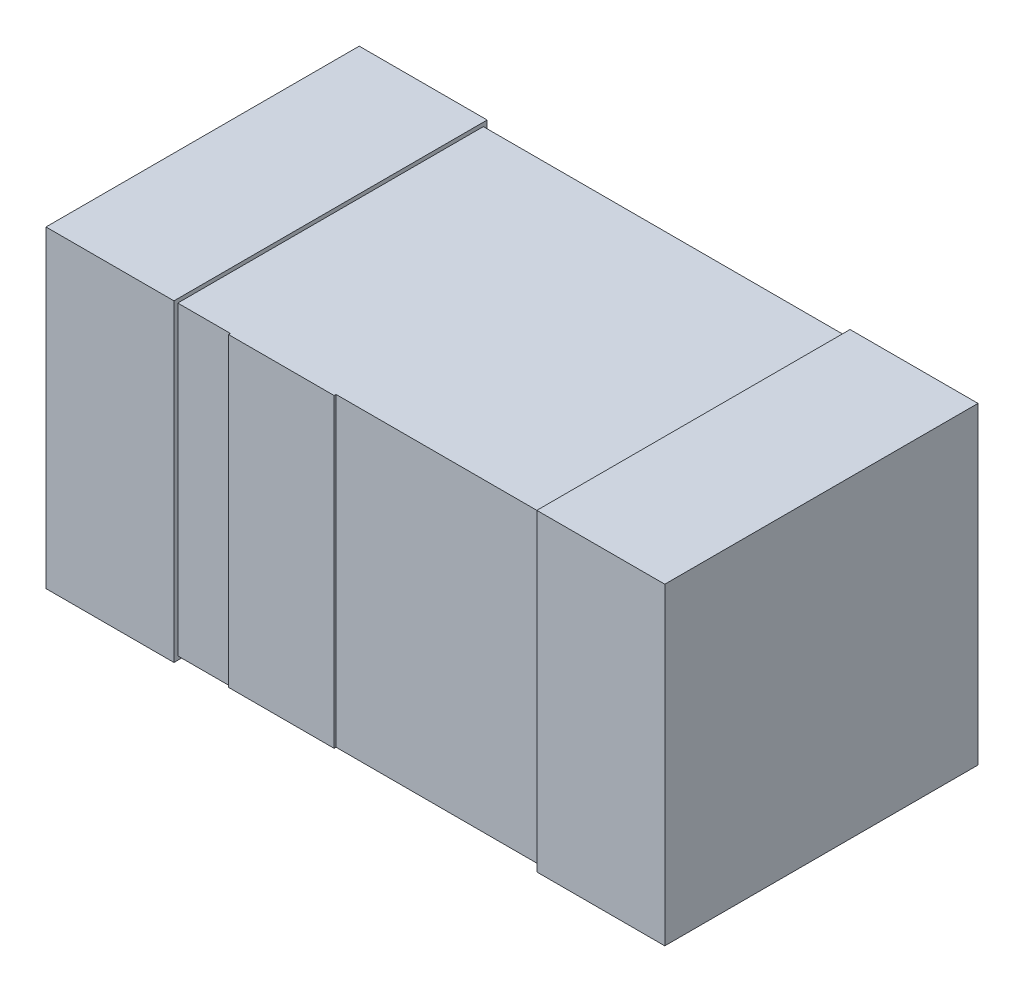
ISO-10303-21;
HEADER;
FILE_DESCRIPTION(('STEP AP214'),'2;1');
FILE_NAME('part.step','',(''),(''),'','','');
FILE_SCHEMA(('AUTOMOTIVE_DESIGN { 1 0 10303 214 1 1 1 1 }'));
ENDSEC;
DATA;
#1=APPLICATION_CONTEXT('core data for automotive mechanical design processes');
#2=APPLICATION_PROTOCOL_DEFINITION('international standard','automotive_design',2000,#1);
#3=PRODUCT_CONTEXT('',#1,'mechanical');
#4=PRODUCT('Part','Part','',(#3));
#5=PRODUCT_RELATED_PRODUCT_CATEGORY('part','',(#4));
#6=PRODUCT_DEFINITION_FORMATION('','',#4);
#7=PRODUCT_DEFINITION_CONTEXT('part definition',#1,'design');
#8=PRODUCT_DEFINITION('design','',#6,#7);
#9=PRODUCT_DEFINITION_SHAPE('','',#8);
#10=(LENGTH_UNIT() NAMED_UNIT(*) SI_UNIT(.MILLI.,.METRE.));
#11=(NAMED_UNIT(*) PLANE_ANGLE_UNIT() SI_UNIT($,.RADIAN.));
#12=(NAMED_UNIT(*) SI_UNIT($,.STERADIAN.) SOLID_ANGLE_UNIT());
#13=UNCERTAINTY_MEASURE_WITH_UNIT(LENGTH_MEASURE(1.E-05),#10,'distance_accuracy_value','');
#14=(GEOMETRIC_REPRESENTATION_CONTEXT(3) GLOBAL_UNCERTAINTY_ASSIGNED_CONTEXT((#13)) GLOBAL_UNIT_ASSIGNED_CONTEXT((#10,
#11,#12)) REPRESENTATION_CONTEXT('',''));
#15=CARTESIAN_POINT('',(0.,0.,0.));
#16=DIRECTION('',(0.,0.,1.));
#17=DIRECTION('',(1.,0.,0.));
#18=AXIS2_PLACEMENT_3D('',#15,#16,#17);
#19=CARTESIAN_POINT('',(0.,0.,1.6));
#20=DIRECTION('',(0.,0.,1.));
#21=DIRECTION('',(1.,0.,0.));
#22=AXIS2_PLACEMENT_3D('',#19,#20,#21);
#23=PLANE('',#22);
#24=DIRECTION('',(1.,0.,0.));
#25=VECTOR('',#24,1.);
#26=CARTESIAN_POINT('',(-1.6,-0.8,1.6));
#27=LINE('',#26,#25);
#28=CARTESIAN_POINT('',(-0.95,-0.8,1.6));
#29=VERTEX_POINT('',#28);
#30=CARTESIAN_POINT('',(-0.67375,-0.8,1.6));
#31=VERTEX_POINT('',#30);
#32=EDGE_CURVE('E264',#29,#31,#27,.T.);
#33=ORIENTED_EDGE('',*,*,#32,.T.);
#34=DIRECTION('',(0.,-1.,0.));
#35=VECTOR('',#34,1.);
#36=CARTESIAN_POINT('',(-0.67375,-0.8,1.6));
#37=LINE('',#36,#35);
#38=CARTESIAN_POINT('',(-0.67375,0.8,1.6));
#39=VERTEX_POINT('',#38);
#40=EDGE_CURVE('E173',#39,#31,#37,.T.);
#41=ORIENTED_EDGE('',*,*,#40,.F.);
#42=DIRECTION('',(-1.,0.,0.));
#43=VECTOR('',#42,1.);
#44=CARTESIAN_POINT('',(-1.6,0.8,1.6));
#45=LINE('',#44,#43);
#46=CARTESIAN_POINT('',(-0.95,0.8,1.6));
#47=VERTEX_POINT('',#46);
#48=EDGE_CURVE('E263',#39,#47,#45,.T.);
#49=ORIENTED_EDGE('',*,*,#48,.T.);
#50=DIRECTION('',(0.,1.,0.));
#51=VECTOR('',#50,1.);
#52=CARTESIAN_POINT('',(-0.95,0.,1.6));
#53=LINE('',#52,#51);
#54=EDGE_CURVE('E219',#29,#47,#53,.T.);
#55=ORIENTED_EDGE('',*,*,#54,.F.);
#56=EDGE_LOOP('',(#33,#41,#49,#55));
#57=FACE_BOUND('',#56,.T.);
#58=ADVANCED_FACE('F37',(#57),#23,.T.);
#59=CARTESIAN_POINT('',(0.95,0.8,1.6));
#60=VERTEX_POINT('',#59);
#61=CARTESIAN_POINT('',(-0.12125,0.8,1.6));
#62=VERTEX_POINT('',#61);
#63=EDGE_CURVE('E52',#60,#62,#45,.T.);
#64=ORIENTED_EDGE('',*,*,#63,.T.);
#65=DIRECTION('',(0.,1.,0.));
#66=VECTOR('',#65,1.);
#67=CARTESIAN_POINT('',(-0.12125,-0.8,1.6));
#68=LINE('',#67,#66);
#69=CARTESIAN_POINT('',(-0.12125,-0.8,1.6));
#70=VERTEX_POINT('',#69);
#71=EDGE_CURVE('E56',#70,#62,#68,.T.);
#72=ORIENTED_EDGE('',*,*,#71,.F.);
#73=CARTESIAN_POINT('',(0.95,-0.8,1.6));
#74=VERTEX_POINT('',#73);
#75=EDGE_CURVE('E262',#70,#74,#27,.T.);
#76=ORIENTED_EDGE('',*,*,#75,.T.);
#77=DIRECTION('',(0.,-1.,0.));
#78=VECTOR('',#77,1.);
#79=CARTESIAN_POINT('',(0.95,0.,1.6));
#80=LINE('',#79,#78);
#81=EDGE_CURVE('E257',#60,#74,#80,.T.);
#82=ORIENTED_EDGE('',*,*,#81,.F.);
#83=EDGE_LOOP('',(#64,#72,#76,#82));
#84=FACE_BOUND('',#83,.T.);
#85=ADVANCED_FACE('F299',(#84),#23,.T.);
#86=CARTESIAN_POINT('',(1.62,-0.82,-0.0200000000000001));
#87=DIRECTION('',(0.,0.,1.));
#88=DIRECTION('',(1.,0.,0.));
#89=AXIS2_PLACEMENT_3D('',#86,#87,#88);
#90=PLANE('',#89);
#91=DIRECTION('',(-1.,0.,0.));
#92=VECTOR('',#91,1.);
#93=CARTESIAN_POINT('',(1.62,-0.82,-0.0200000000000001));
#94=LINE('',#93,#92);
#95=CARTESIAN_POINT('',(1.62,-0.82,-0.0200000000000001));
#96=VERTEX_POINT('',#95);
#97=CARTESIAN_POINT('',(0.95,-0.82,-0.0200000000000001));
#98=VERTEX_POINT('',#97);
#99=EDGE_CURVE('E243',#96,#98,#94,.T.);
#100=ORIENTED_EDGE('',*,*,#99,.T.);
#101=DIRECTION('',(0.,1.,0.));
#102=VECTOR('',#101,1.);
#103=CARTESIAN_POINT('',(0.95,-0.82,-0.0200000000000001));
#104=LINE('',#103,#102);
#105=CARTESIAN_POINT('',(0.95,0.819999999999999,-0.0200000000000001));
#106=VERTEX_POINT('',#105);
#107=EDGE_CURVE('E222',#98,#106,#104,.T.);
#108=ORIENTED_EDGE('',*,*,#107,.T.);
#109=DIRECTION('',(-1.,0.,0.));
#110=VECTOR('',#109,1.);
#111=CARTESIAN_POINT('',(1.62,0.819999999999999,-0.0200000000000001));
#112=LINE('',#111,#110);
#113=CARTESIAN_POINT('',(1.62,0.819999999999999,-0.0200000000000001));
#114=VERTEX_POINT('',#113);
#115=EDGE_CURVE('E249',#114,#106,#112,.T.);
#116=ORIENTED_EDGE('',*,*,#115,.F.);
#117=DIRECTION('',(0.,1.,0.));
#118=VECTOR('',#117,1.);
#119=CARTESIAN_POINT('',(1.62,-0.82,-0.0200000000000001));
#120=LINE('',#119,#118);
#121=EDGE_CURVE('E234',#96,#114,#120,.T.);
#122=ORIENTED_EDGE('',*,*,#121,.F.);
#123=EDGE_LOOP('',(#100,#108,#116,#122));
#124=FACE_BOUND('',#123,.T.);
#125=ADVANCED_FACE('F305',(#124),#90,.F.);
#126=CARTESIAN_POINT('',(1.62,0.819999999999999,1.62));
#127=DIRECTION('',(0.,-1.,0.));
#128=DIRECTION('',(0.,0.,-1.));
#129=AXIS2_PLACEMENT_3D('',#126,#127,#128);
#130=PLANE('',#129);
#131=ORIENTED_EDGE('',*,*,#115,.T.);
#132=DIRECTION('',(0.,0.,1.));
#133=VECTOR('',#132,1.);
#134=CARTESIAN_POINT('',(0.95,0.819999999999999,1.62));
#135=LINE('',#134,#133);
#136=CARTESIAN_POINT('',(0.95,0.819999999999999,1.62));
#137=VERTEX_POINT('',#136);
#138=EDGE_CURVE('E225',#106,#137,#135,.T.);
#139=ORIENTED_EDGE('',*,*,#138,.T.);
#140=DIRECTION('',(-1.,0.,0.));
#141=VECTOR('',#140,1.);
#142=CARTESIAN_POINT('',(1.62,0.819999999999999,1.62));
#143=LINE('',#142,#141);
#144=CARTESIAN_POINT('',(1.62,0.819999999999999,1.62));
#145=VERTEX_POINT('',#144);
#146=EDGE_CURVE('E247',#145,#137,#143,.T.);
#147=ORIENTED_EDGE('',*,*,#146,.F.);
#148=DIRECTION('',(0.,0.,1.));
#149=VECTOR('',#148,1.);
#150=CARTESIAN_POINT('',(1.62,0.819999999999999,1.62));
#151=LINE('',#150,#149);
#152=EDGE_CURVE('E237',#114,#145,#151,.T.);
#153=ORIENTED_EDGE('',*,*,#152,.F.);
#154=EDGE_LOOP('',(#131,#139,#147,#153));
#155=FACE_BOUND('',#154,.T.);
#156=ADVANCED_FACE('F334',(#155),#130,.F.);
#157=CARTESIAN_POINT('',(1.62,-0.82,1.62));
#158=DIRECTION('',(0.,0.,-1.));
#159=DIRECTION('',(-1.,0.,0.));
#160=AXIS2_PLACEMENT_3D('',#157,#158,#159);
#161=PLANE('',#160);
#162=ORIENTED_EDGE('',*,*,#146,.T.);
#163=DIRECTION('',(0.,-1.,0.));
#164=VECTOR('',#163,1.);
#165=CARTESIAN_POINT('',(0.95,-0.82,1.62));
#166=LINE('',#165,#164);
#167=CARTESIAN_POINT('',(0.95,-0.82,1.62));
#168=VERTEX_POINT('',#167);
#169=EDGE_CURVE('E228',#137,#168,#166,.T.);
#170=ORIENTED_EDGE('',*,*,#169,.T.);
#171=DIRECTION('',(-1.,0.,0.));
#172=VECTOR('',#171,1.);
#173=CARTESIAN_POINT('',(1.62,-0.82,1.62));
#174=LINE('',#173,#172);
#175=CARTESIAN_POINT('',(1.62,-0.82,1.62));
#176=VERTEX_POINT('',#175);
#177=EDGE_CURVE('E245',#176,#168,#174,.T.);
#178=ORIENTED_EDGE('',*,*,#177,.F.);
#179=DIRECTION('',(0.,-1.,0.));
#180=VECTOR('',#179,1.);
#181=CARTESIAN_POINT('',(1.62,-0.82,1.62));
#182=LINE('',#181,#180);
#183=EDGE_CURVE('E239',#145,#176,#182,.T.);
#184=ORIENTED_EDGE('',*,*,#183,.F.);
#185=EDGE_LOOP('',(#162,#170,#178,#184));
#186=FACE_BOUND('',#185,.T.);
#187=ADVANCED_FACE('F331',(#186),#161,.F.);
#188=CARTESIAN_POINT('',(1.62,-0.82,1.62));
#189=DIRECTION('',(0.,1.,0.));
#190=DIRECTION('',(0.,0.,1.));
#191=AXIS2_PLACEMENT_3D('',#188,#189,#190);
#192=PLANE('',#191);
#193=ORIENTED_EDGE('',*,*,#177,.T.);
#194=DIRECTION('',(0.,0.,-1.));
#195=VECTOR('',#194,1.);
#196=CARTESIAN_POINT('',(0.95,-0.82,1.62));
#197=LINE('',#196,#195);
#198=EDGE_CURVE('E231',#168,#98,#197,.T.);
#199=ORIENTED_EDGE('',*,*,#198,.T.);
#200=ORIENTED_EDGE('',*,*,#99,.F.);
#201=DIRECTION('',(0.,0.,-1.));
#202=VECTOR('',#201,1.);
#203=CARTESIAN_POINT('',(1.62,-0.82,1.62));
#204=LINE('',#203,#202);
#205=EDGE_CURVE('E241',#176,#96,#204,.T.);
#206=ORIENTED_EDGE('',*,*,#205,.F.);
#207=EDGE_LOOP('',(#193,#199,#200,#206));
#208=FACE_BOUND('',#207,.T.);
#209=ADVANCED_FACE('F323',(#208),#192,.F.);
#210=CARTESIAN_POINT('',(1.62,0.,0.));
#211=DIRECTION('',(-1.,0.,0.));
#212=DIRECTION('',(0.,0.,1.));
#213=AXIS2_PLACEMENT_3D('',#210,#211,#212);
#214=PLANE('',#213);
#215=ORIENTED_EDGE('',*,*,#121,.T.);
#216=ORIENTED_EDGE('',*,*,#152,.T.);
#217=ORIENTED_EDGE('',*,*,#183,.T.);
#218=ORIENTED_EDGE('',*,*,#205,.T.);
#219=EDGE_LOOP('',(#215,#216,#217,#218));
#220=FACE_BOUND('',#219,.T.);
#221=ADVANCED_FACE('F318',(#220),#214,.F.);
#222=CARTESIAN_POINT('',(0.95,0.,0.));
#223=DIRECTION('',(-1.,0.,0.));
#224=DIRECTION('',(0.,0.,1.));
#225=AXIS2_PLACEMENT_3D('',#222,#223,#224);
#226=PLANE('',#225);
#227=DIRECTION('',(0.,0.,-1.));
#228=VECTOR('',#227,1.);
#229=CARTESIAN_POINT('',(0.95,0.8,1.6));
#230=LINE('',#229,#228);
#231=CARTESIAN_POINT('',(0.95,0.8,0.));
#232=VERTEX_POINT('',#231);
#233=EDGE_CURVE('E254',#60,#232,#230,.T.);
#234=ORIENTED_EDGE('',*,*,#233,.F.);
#235=ORIENTED_EDGE('',*,*,#81,.T.);
#236=DIRECTION('',(0.,0.,1.));
#237=VECTOR('',#236,1.);
#238=CARTESIAN_POINT('',(0.95,-0.8,1.6));
#239=LINE('',#238,#237);
#240=CARTESIAN_POINT('',(0.95,-0.8,0.));
#241=VERTEX_POINT('',#240);
#242=EDGE_CURVE('E251',#241,#74,#239,.T.);
#243=ORIENTED_EDGE('',*,*,#242,.F.);
#244=DIRECTION('',(0.,-1.,0.));
#245=VECTOR('',#244,1.);
#246=CARTESIAN_POINT('',(0.95,0.,0.));
#247=LINE('',#246,#245);
#248=EDGE_CURVE('E45',#232,#241,#247,.T.);
#249=ORIENTED_EDGE('',*,*,#248,.F.);
#250=EDGE_LOOP('',(#234,#235,#243,#249));
#251=FACE_BOUND('',#250,.T.);
#252=ORIENTED_EDGE('',*,*,#107,.F.);
#253=ORIENTED_EDGE('',*,*,#198,.F.);
#254=ORIENTED_EDGE('',*,*,#169,.F.);
#255=ORIENTED_EDGE('',*,*,#138,.F.);
#256=EDGE_LOOP('',(#252,#253,#254,#255));
#257=FACE_BOUND('',#256,.T.);
#258=ADVANCED_FACE('F276',(#251,#257),#226,.T.);
#259=CARTESIAN_POINT('',(-1.6,0.8,1.6));
#260=DIRECTION('',(0.,-1.,0.));
#261=DIRECTION('',(0.,0.,-1.));
#262=AXIS2_PLACEMENT_3D('',#259,#260,#261);
#263=PLANE('',#262);
#264=DIRECTION('',(-1.,0.,0.));
#265=VECTOR('',#264,1.);
#266=CARTESIAN_POINT('',(-1.6,0.8,0.));
#267=LINE('',#266,#265);
#268=CARTESIAN_POINT('',(-0.95,0.8,0.));
#269=VERTEX_POINT('',#268);
#270=EDGE_CURVE('E260',#232,#269,#267,.T.);
#271=ORIENTED_EDGE('',*,*,#270,.T.);
#272=DIRECTION('',(0.,0.,1.));
#273=VECTOR('',#272,1.);
#274=CARTESIAN_POINT('',(-0.95,0.8,1.6));
#275=LINE('',#274,#273);
#276=EDGE_CURVE('E216',#269,#47,#275,.T.);
#277=ORIENTED_EDGE('',*,*,#276,.T.);
#278=ORIENTED_EDGE('',*,*,#48,.F.);
#279=DIRECTION('',(0.,0.,-1.));
#280=VECTOR('',#279,1.);
#281=CARTESIAN_POINT('',(-0.67375,0.8,1.61));
#282=LINE('',#281,#280);
#283=CARTESIAN_POINT('',(-0.67375,0.8,1.61));
#284=VERTEX_POINT('',#283);
#285=EDGE_CURVE('E282',#284,#39,#282,.T.);
#286=ORIENTED_EDGE('',*,*,#285,.F.);
#287=DIRECTION('',(-1.,0.,0.));
#288=VECTOR('',#287,1.);
#289=CARTESIAN_POINT('',(-0.67375,0.8,1.61));
#290=LINE('',#289,#288);
#291=CARTESIAN_POINT('',(-0.12125,0.8,1.61));
#292=VERTEX_POINT('',#291);
#293=EDGE_CURVE('E166',#292,#284,#290,.T.);
#294=ORIENTED_EDGE('',*,*,#293,.F.);
#295=DIRECTION('',(0.,0.,-1.));
#296=VECTOR('',#295,1.);
#297=CARTESIAN_POINT('',(-0.12125,0.8,1.61));
#298=LINE('',#297,#296);
#299=EDGE_CURVE('E179',#292,#62,#298,.T.);
#300=ORIENTED_EDGE('',*,*,#299,.T.);
#301=ORIENTED_EDGE('',*,*,#63,.F.);
#302=ORIENTED_EDGE('',*,*,#233,.T.);
#303=EDGE_LOOP('',(#271,#277,#278,#286,#294,#300,#301,#302));
#304=FACE_BOUND('',#303,.T.);
#305=ADVANCED_FACE('F39',(#304),#263,.F.);
#306=CARTESIAN_POINT('',(-1.6,-0.8,1.6));
#307=DIRECTION('',(0.,1.,0.));
#308=DIRECTION('',(0.,0.,1.));
#309=AXIS2_PLACEMENT_3D('',#306,#307,#308);
#310=PLANE('',#309);
#311=ORIENTED_EDGE('',*,*,#32,.F.);
#312=DIRECTION('',(0.,0.,-1.));
#313=VECTOR('',#312,1.);
#314=CARTESIAN_POINT('',(-0.95,-0.8,1.6));
#315=LINE('',#314,#313);
#316=CARTESIAN_POINT('',(-0.95,-0.8,0.));
#317=VERTEX_POINT('',#316);
#318=EDGE_CURVE('E213',#29,#317,#315,.T.);
#319=ORIENTED_EDGE('',*,*,#318,.T.);
#320=DIRECTION('',(1.,0.,0.));
#321=VECTOR('',#320,1.);
#322=CARTESIAN_POINT('',(-1.6,-0.8,0.));
#323=LINE('',#322,#321);
#324=EDGE_CURVE('E268',#317,#241,#323,.T.);
#325=ORIENTED_EDGE('',*,*,#324,.T.);
#326=ORIENTED_EDGE('',*,*,#242,.T.);
#327=ORIENTED_EDGE('',*,*,#75,.F.);
#328=DIRECTION('',(0.,0.,-1.));
#329=VECTOR('',#328,1.);
#330=CARTESIAN_POINT('',(-0.12125,-0.8,1.61));
#331=LINE('',#330,#329);
#332=CARTESIAN_POINT('',(-0.12125,-0.8,1.61));
#333=VERTEX_POINT('',#332);
#334=EDGE_CURVE('E157',#333,#70,#331,.T.);
#335=ORIENTED_EDGE('',*,*,#334,.F.);
#336=DIRECTION('',(1.,0.,0.));
#337=VECTOR('',#336,1.);
#338=CARTESIAN_POINT('',(-0.67375,-0.8,1.61));
#339=LINE('',#338,#337);
#340=CARTESIAN_POINT('',(-0.67375,-0.8,1.61));
#341=VERTEX_POINT('',#340);
#342=EDGE_CURVE('E149',#341,#333,#339,.T.);
#343=ORIENTED_EDGE('',*,*,#342,.F.);
#344=DIRECTION('',(0.,0.,-1.));
#345=VECTOR('',#344,1.);
#346=CARTESIAN_POINT('',(-0.67375,-0.8,1.61));
#347=LINE('',#346,#345);
#348=EDGE_CURVE('E154',#341,#31,#347,.T.);
#349=ORIENTED_EDGE('',*,*,#348,.T.);
#350=EDGE_LOOP('',(#311,#319,#325,#326,#327,#335,#343,#349));
#351=FACE_BOUND('',#350,.T.);
#352=ADVANCED_FACE('F152',(#351),#310,.F.);
#353=CARTESIAN_POINT('',(0.,0.,0.));
#354=DIRECTION('',(0.,0.,1.));
#355=DIRECTION('',(1.,0.,0.));
#356=AXIS2_PLACEMENT_3D('',#353,#354,#355);
#357=PLANE('',#356);
#358=ORIENTED_EDGE('',*,*,#324,.F.);
#359=DIRECTION('',(0.,1.,0.));
#360=VECTOR('',#359,1.);
#361=CARTESIAN_POINT('',(-0.95,0.,0.));
#362=LINE('',#361,#360);
#363=EDGE_CURVE('E11',#317,#269,#362,.T.);
#364=ORIENTED_EDGE('',*,*,#363,.T.);
#365=ORIENTED_EDGE('',*,*,#270,.F.);
#366=ORIENTED_EDGE('',*,*,#248,.T.);
#367=EDGE_LOOP('',(#358,#364,#365,#366));
#368=FACE_BOUND('',#367,.T.);
#369=ADVANCED_FACE('F273',(#368),#357,.F.);
#370=CARTESIAN_POINT('',(-1.62,-0.82,-0.0200000000000001));
#371=DIRECTION('',(0.,0.,1.));
#372=DIRECTION('',(-1.,0.,0.));
#373=AXIS2_PLACEMENT_3D('',#370,#371,#372);
#374=PLANE('',#373);
#375=DIRECTION('',(1.,0.,0.));
#376=VECTOR('',#375,1.);
#377=CARTESIAN_POINT('',(-1.62,-0.82,-0.0200000000000001));
#378=LINE('',#377,#376);
#379=CARTESIAN_POINT('',(-1.62,-0.82,-0.0200000000000001));
#380=VERTEX_POINT('',#379);
#381=CARTESIAN_POINT('',(-0.95,-0.82,-0.0200000000000001));
#382=VERTEX_POINT('',#381);
#383=EDGE_CURVE('E193',#380,#382,#378,.T.);
#384=ORIENTED_EDGE('',*,*,#383,.F.);
#385=DIRECTION('',(0.,1.,0.));
#386=VECTOR('',#385,1.);
#387=CARTESIAN_POINT('',(-1.62,-0.82,-0.0200000000000001));
#388=LINE('',#387,#386);
#389=CARTESIAN_POINT('',(-1.62,0.819999999999999,-0.0200000000000001));
#390=VERTEX_POINT('',#389);
#391=EDGE_CURVE('E198',#380,#390,#388,.T.);
#392=ORIENTED_EDGE('',*,*,#391,.T.);
#393=DIRECTION('',(1.,0.,0.));
#394=VECTOR('',#393,1.);
#395=CARTESIAN_POINT('',(-1.62,0.819999999999999,-0.0200000000000001));
#396=LINE('',#395,#394);
#397=CARTESIAN_POINT('',(-0.95,0.819999999999999,-0.0200000000000001));
#398=VERTEX_POINT('',#397);
#399=EDGE_CURVE('E210',#390,#398,#396,.T.);
#400=ORIENTED_EDGE('',*,*,#399,.T.);
#401=DIRECTION('',(0.,1.,0.));
#402=VECTOR('',#401,1.);
#403=CARTESIAN_POINT('',(-0.95,-0.82,-0.0200000000000001));
#404=LINE('',#403,#402);
#405=EDGE_CURVE('E174',#382,#398,#404,.T.);
#406=ORIENTED_EDGE('',*,*,#405,.F.);
#407=EDGE_LOOP('',(#384,#392,#400,#406));
#408=FACE_BOUND('',#407,.T.);
#409=ADVANCED_FACE('F310',(#408),#374,.F.);
#410=CARTESIAN_POINT('',(-1.62,0.819999999999999,1.62));
#411=DIRECTION('',(0.,-1.,0.));
#412=DIRECTION('',(0.,0.,-1.));
#413=AXIS2_PLACEMENT_3D('',#410,#411,#412);
#414=PLANE('',#413);
#415=ORIENTED_EDGE('',*,*,#399,.F.);
#416=DIRECTION('',(0.,0.,1.));
#417=VECTOR('',#416,1.);
#418=CARTESIAN_POINT('',(-1.62,0.819999999999999,1.62));
#419=LINE('',#418,#417);
#420=CARTESIAN_POINT('',(-1.62,0.819999999999999,1.62));
#421=VERTEX_POINT('',#420);
#422=EDGE_CURVE('E201',#390,#421,#419,.T.);
#423=ORIENTED_EDGE('',*,*,#422,.T.);
#424=DIRECTION('',(1.,0.,0.));
#425=VECTOR('',#424,1.);
#426=CARTESIAN_POINT('',(-1.62,0.819999999999999,1.62));
#427=LINE('',#426,#425);
#428=CARTESIAN_POINT('',(-0.95,0.819999999999999,1.62));
#429=VERTEX_POINT('',#428);
#430=EDGE_CURVE('E207',#421,#429,#427,.T.);
#431=ORIENTED_EDGE('',*,*,#430,.T.);
#432=DIRECTION('',(0.,0.,1.));
#433=VECTOR('',#432,1.);
#434=CARTESIAN_POINT('',(-0.95,0.819999999999999,1.62));
#435=LINE('',#434,#433);
#436=EDGE_CURVE('E187',#398,#429,#435,.T.);
#437=ORIENTED_EDGE('',*,*,#436,.F.);
#438=EDGE_LOOP('',(#415,#423,#431,#437));
#439=FACE_BOUND('',#438,.T.);
#440=ADVANCED_FACE('F421',(#439),#414,.F.);
#441=CARTESIAN_POINT('',(-1.62,-0.82,1.62));
#442=DIRECTION('',(0.,0.,-1.));
#443=DIRECTION('',(1.,0.,0.));
#444=AXIS2_PLACEMENT_3D('',#441,#442,#443);
#445=PLANE('',#444);
#446=ORIENTED_EDGE('',*,*,#430,.F.);
#447=DIRECTION('',(0.,-1.,0.));
#448=VECTOR('',#447,1.);
#449=CARTESIAN_POINT('',(-1.62,-0.82,1.62));
#450=LINE('',#449,#448);
#451=CARTESIAN_POINT('',(-1.62,-0.82,1.62));
#452=VERTEX_POINT('',#451);
#453=EDGE_CURVE('E204',#421,#452,#450,.T.);
#454=ORIENTED_EDGE('',*,*,#453,.T.);
#455=DIRECTION('',(1.,0.,0.));
#456=VECTOR('',#455,1.);
#457=CARTESIAN_POINT('',(-1.62,-0.82,1.62));
#458=LINE('',#457,#456);
#459=CARTESIAN_POINT('',(-0.95,-0.82,1.62));
#460=VERTEX_POINT('',#459);
#461=EDGE_CURVE('E190',#452,#460,#458,.T.);
#462=ORIENTED_EDGE('',*,*,#461,.T.);
#463=DIRECTION('',(0.,-1.,0.));
#464=VECTOR('',#463,1.);
#465=CARTESIAN_POINT('',(-0.95,-0.82,1.62));
#466=LINE('',#465,#464);
#467=EDGE_CURVE('E184',#429,#460,#466,.T.);
#468=ORIENTED_EDGE('',*,*,#467,.F.);
#469=EDGE_LOOP('',(#446,#454,#462,#468));
#470=FACE_BOUND('',#469,.T.);
#471=ADVANCED_FACE('F414',(#470),#445,.F.);
#472=CARTESIAN_POINT('',(-1.62,0.,0.));
#473=DIRECTION('',(1.,0.,0.));
#474=DIRECTION('',(0.,0.,1.));
#475=AXIS2_PLACEMENT_3D('',#472,#473,#474);
#476=PLANE('',#475);
#477=ORIENTED_EDGE('',*,*,#391,.F.);
#478=DIRECTION('',(0.,0.,-1.));
#479=VECTOR('',#478,1.);
#480=CARTESIAN_POINT('',(-1.62,-0.82,1.62));
#481=LINE('',#480,#479);
#482=EDGE_CURVE('E196',#452,#380,#481,.T.);
#483=ORIENTED_EDGE('',*,*,#482,.F.);
#484=ORIENTED_EDGE('',*,*,#453,.F.);
#485=ORIENTED_EDGE('',*,*,#422,.F.);
#486=EDGE_LOOP('',(#477,#483,#484,#485));
#487=FACE_BOUND('',#486,.T.);
#488=ADVANCED_FACE('F406',(#487),#476,.F.);
#489=CARTESIAN_POINT('',(-1.62,-0.82,1.62));
#490=DIRECTION('',(0.,1.,0.));
#491=DIRECTION('',(0.,0.,1.));
#492=AXIS2_PLACEMENT_3D('',#489,#490,#491);
#493=PLANE('',#492);
#494=ORIENTED_EDGE('',*,*,#461,.F.);
#495=ORIENTED_EDGE('',*,*,#482,.T.);
#496=ORIENTED_EDGE('',*,*,#383,.T.);
#497=DIRECTION('',(0.,0.,-1.));
#498=VECTOR('',#497,1.);
#499=CARTESIAN_POINT('',(-0.95,-0.82,1.62));
#500=LINE('',#499,#498);
#501=EDGE_CURVE('E177',#460,#382,#500,.T.);
#502=ORIENTED_EDGE('',*,*,#501,.F.);
#503=EDGE_LOOP('',(#494,#495,#496,#502));
#504=FACE_BOUND('',#503,.T.);
#505=ADVANCED_FACE('F397',(#504),#493,.F.);
#506=CARTESIAN_POINT('',(-0.95,0.,0.));
#507=DIRECTION('',(1.,0.,0.));
#508=DIRECTION('',(0.,0.,1.));
#509=AXIS2_PLACEMENT_3D('',#506,#507,#508);
#510=PLANE('',#509);
#511=ORIENTED_EDGE('',*,*,#318,.F.);
#512=ORIENTED_EDGE('',*,*,#54,.T.);
#513=ORIENTED_EDGE('',*,*,#276,.F.);
#514=ORIENTED_EDGE('',*,*,#363,.F.);
#515=EDGE_LOOP('',(#511,#512,#513,#514));
#516=FACE_BOUND('',#515,.T.);
#517=ORIENTED_EDGE('',*,*,#405,.T.);
#518=ORIENTED_EDGE('',*,*,#436,.T.);
#519=ORIENTED_EDGE('',*,*,#467,.T.);
#520=ORIENTED_EDGE('',*,*,#501,.T.);
#521=EDGE_LOOP('',(#517,#518,#519,#520));
#522=FACE_BOUND('',#521,.T.);
#523=ADVANCED_FACE('F296',(#516,#522),#510,.T.);
#524=CARTESIAN_POINT('',(-0.67375,-0.8,1.61));
#525=DIRECTION('',(1.,0.,0.));
#526=DIRECTION('',(0.,0.,-1.));
#527=AXIS2_PLACEMENT_3D('',#524,#525,#526);
#528=PLANE('',#527);
#529=ORIENTED_EDGE('',*,*,#40,.T.);
#530=ORIENTED_EDGE('',*,*,#348,.F.);
#531=DIRECTION('',(0.,-1.,0.));
#532=VECTOR('',#531,1.);
#533=CARTESIAN_POINT('',(-0.67375,-0.8,1.61));
#534=LINE('',#533,#532);
#535=EDGE_CURVE('E161',#284,#341,#534,.T.);
#536=ORIENTED_EDGE('',*,*,#535,.F.);
#537=ORIENTED_EDGE('',*,*,#285,.T.);
#538=EDGE_LOOP('',(#529,#530,#536,#537));
#539=FACE_BOUND('',#538,.T.);
#540=ADVANCED_FACE('F171',(#539),#528,.F.);
#541=CARTESIAN_POINT('',(-0.12125,-0.8,1.61));
#542=DIRECTION('',(-1.,0.,0.));
#543=DIRECTION('',(0.,-1.,0.));
#544=AXIS2_PLACEMENT_3D('',#541,#542,#543);
#545=PLANE('',#544);
#546=ORIENTED_EDGE('',*,*,#71,.T.);
#547=ORIENTED_EDGE('',*,*,#299,.F.);
#548=DIRECTION('',(0.,1.,0.));
#549=VECTOR('',#548,1.);
#550=CARTESIAN_POINT('',(-0.12125,-0.8,1.61));
#551=LINE('',#550,#549);
#552=EDGE_CURVE('E160',#333,#292,#551,.T.);
#553=ORIENTED_EDGE('',*,*,#552,.F.);
#554=ORIENTED_EDGE('',*,*,#334,.T.);
#555=EDGE_LOOP('',(#546,#547,#553,#554));
#556=FACE_BOUND('',#555,.T.);
#557=ADVANCED_FACE('F288',(#556),#545,.F.);
#558=CARTESIAN_POINT('',(0.,0.,1.61));
#559=DIRECTION('',(0.,0.,-1.));
#560=DIRECTION('',(-1.,0.,0.));
#561=AXIS2_PLACEMENT_3D('',#558,#559,#560);
#562=PLANE('',#561);
#563=ORIENTED_EDGE('',*,*,#535,.T.);
#564=ORIENTED_EDGE('',*,*,#342,.T.);
#565=ORIENTED_EDGE('',*,*,#552,.T.);
#566=ORIENTED_EDGE('',*,*,#293,.T.);
#567=EDGE_LOOP('',(#563,#564,#565,#566));
#568=FACE_BOUND('',#567,.T.);
#569=ADVANCED_FACE('F164',(#568),#562,.F.);
#570=CLOSED_SHELL('',(#58,#85,#125,#156,#187,#209,#221,#258,#305,#352,#369,#409,#440,#471,#488,
#505,#523,#540,#557,#569));
#571=MANIFOLD_SOLID_BREP('B2',#570);
#572=ADVANCED_BREP_SHAPE_REPRESENTATION('',(#18,#571),#14);
#573=SHAPE_DEFINITION_REPRESENTATION(#9,#572);
ENDSEC;
END-ISO-10303-21;
